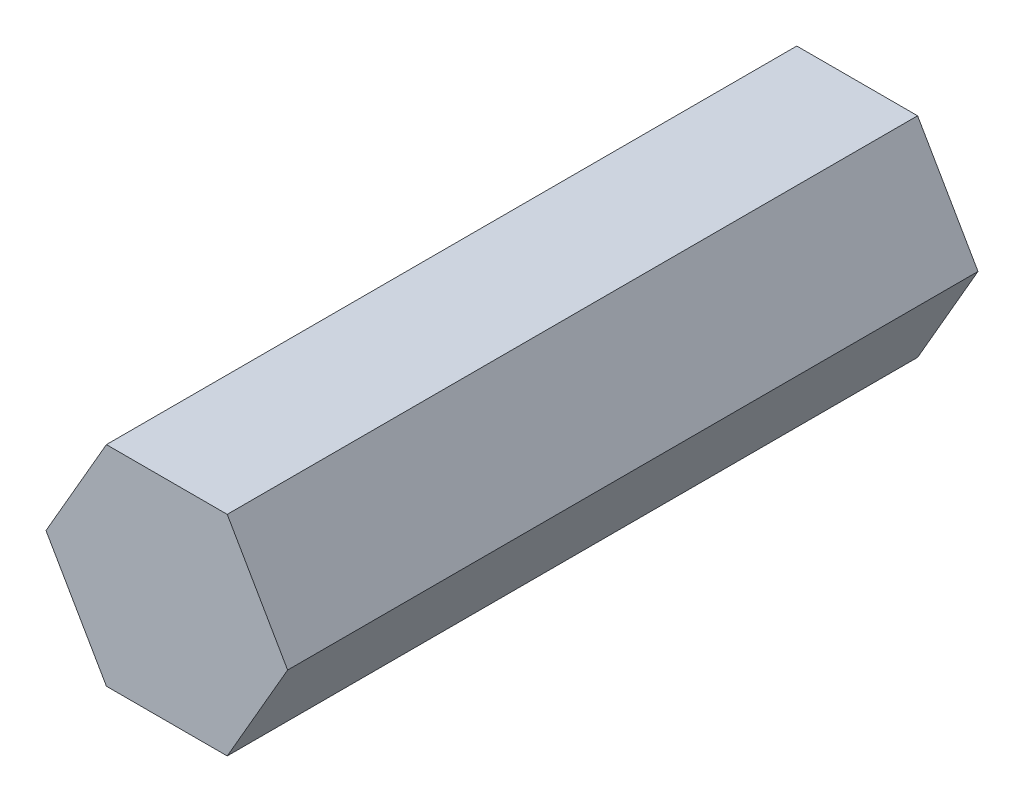
ISO-10303-21;
HEADER;
FILE_DESCRIPTION(('STEP AP214'),'2;1');
FILE_NAME('part.step','',(''),(''),'','','');
FILE_SCHEMA(('AUTOMOTIVE_DESIGN { 1 0 10303 214 1 1 1 1 }'));
ENDSEC;
DATA;
#1=APPLICATION_CONTEXT('core data for automotive mechanical design processes');
#2=APPLICATION_PROTOCOL_DEFINITION('international standard','automotive_design',2000,#1);
#3=PRODUCT_CONTEXT('',#1,'mechanical');
#4=PRODUCT('Part','Part','',(#3));
#5=PRODUCT_RELATED_PRODUCT_CATEGORY('part','',(#4));
#6=PRODUCT_DEFINITION_FORMATION('','',#4);
#7=PRODUCT_DEFINITION_CONTEXT('part definition',#1,'design');
#8=PRODUCT_DEFINITION('design','',#6,#7);
#9=PRODUCT_DEFINITION_SHAPE('','',#8);
#10=(LENGTH_UNIT() NAMED_UNIT(*) SI_UNIT(.MILLI.,.METRE.));
#11=(NAMED_UNIT(*) PLANE_ANGLE_UNIT() SI_UNIT($,.RADIAN.));
#12=(NAMED_UNIT(*) SI_UNIT($,.STERADIAN.) SOLID_ANGLE_UNIT());
#13=UNCERTAINTY_MEASURE_WITH_UNIT(LENGTH_MEASURE(1.E-05),#10,'distance_accuracy_value','');
#14=(GEOMETRIC_REPRESENTATION_CONTEXT(3) GLOBAL_UNCERTAINTY_ASSIGNED_CONTEXT((#13)) GLOBAL_UNIT_ASSIGNED_CONTEXT((#10,
#11,#12)) REPRESENTATION_CONTEXT('',''));
#15=CARTESIAN_POINT('',(0.,0.,0.));
#16=DIRECTION('',(0.,0.,1.));
#17=DIRECTION('',(1.,0.,0.));
#18=AXIS2_PLACEMENT_3D('',#15,#16,#17);
#19=CARTESIAN_POINT('',(17.5,-30.3108891324554,200.));
#20=DIRECTION('',(-0.866025403784439,0.5,0.));
#21=DIRECTION('',(-0.5,-0.866025403784439,0.));
#22=AXIS2_PLACEMENT_3D('',#19,#20,#21);
#23=PLANE('',#22);
#24=DIRECTION('',(0.5,0.866025403784439,0.));
#25=VECTOR('',#24,1.);
#26=CARTESIAN_POINT('',(17.5,-30.3108891324554,0.));
#27=LINE('',#26,#25);
#28=CARTESIAN_POINT('',(17.5,-30.3108891324554,0.));
#29=VERTEX_POINT('',#28);
#30=CARTESIAN_POINT('',(35.,0.,0.));
#31=VERTEX_POINT('',#30);
#32=EDGE_CURVE('E116',#29,#31,#27,.T.);
#33=ORIENTED_EDGE('',*,*,#32,.T.);
#34=DIRECTION('',(0.,0.,-1.));
#35=VECTOR('',#34,1.);
#36=CARTESIAN_POINT('',(35.,0.,200.));
#37=LINE('',#36,#35);
#38=CARTESIAN_POINT('',(35.,0.,200.));
#39=VERTEX_POINT('',#38);
#40=EDGE_CURVE('E11',#39,#31,#37,.T.);
#41=ORIENTED_EDGE('',*,*,#40,.F.);
#42=DIRECTION('',(0.5,0.866025403784439,0.));
#43=VECTOR('',#42,1.);
#44=CARTESIAN_POINT('',(17.5,-30.3108891324554,200.));
#45=LINE('',#44,#43);
#46=CARTESIAN_POINT('',(17.5,-30.3108891324554,200.));
#47=VERTEX_POINT('',#46);
#48=EDGE_CURVE('E126',#47,#39,#45,.T.);
#49=ORIENTED_EDGE('',*,*,#48,.F.);
#50=DIRECTION('',(0.,0.,-1.));
#51=VECTOR('',#50,1.);
#52=CARTESIAN_POINT('',(17.5,-30.3108891324554,200.));
#53=LINE('',#52,#51);
#54=EDGE_CURVE('E112',#47,#29,#53,.T.);
#55=ORIENTED_EDGE('',*,*,#54,.T.);
#56=EDGE_LOOP('',(#33,#41,#49,#55));
#57=FACE_BOUND('',#56,.T.);
#58=ADVANCED_FACE('F32',(#57),#23,.F.);
#59=CARTESIAN_POINT('',(35.,0.,200.));
#60=DIRECTION('',(-0.866025403784438,-0.5,0.));
#61=DIRECTION('',(0.5,-0.866025403784439,0.));
#62=AXIS2_PLACEMENT_3D('',#59,#60,#61);
#63=PLANE('',#62);
#64=DIRECTION('',(-0.5,0.866025403784438,0.));
#65=VECTOR('',#64,1.);
#66=CARTESIAN_POINT('',(35.,0.,0.));
#67=LINE('',#66,#65);
#68=CARTESIAN_POINT('',(17.5,30.3108891324553,0.));
#69=VERTEX_POINT('',#68);
#70=EDGE_CURVE('E119',#31,#69,#67,.T.);
#71=ORIENTED_EDGE('',*,*,#70,.T.);
#72=DIRECTION('',(0.,0.,-1.));
#73=VECTOR('',#72,1.);
#74=CARTESIAN_POINT('',(17.5,30.3108891324553,200.));
#75=LINE('',#74,#73);
#76=CARTESIAN_POINT('',(17.5,30.3108891324553,200.));
#77=VERTEX_POINT('',#76);
#78=EDGE_CURVE('E40',#77,#69,#75,.T.);
#79=ORIENTED_EDGE('',*,*,#78,.F.);
#80=DIRECTION('',(-0.5,0.866025403784438,0.));
#81=VECTOR('',#80,1.);
#82=CARTESIAN_POINT('',(35.,0.,200.));
#83=LINE('',#82,#81);
#84=EDGE_CURVE('E85',#39,#77,#83,.T.);
#85=ORIENTED_EDGE('',*,*,#84,.F.);
#86=ORIENTED_EDGE('',*,*,#40,.T.);
#87=EDGE_LOOP('',(#71,#79,#85,#86));
#88=FACE_BOUND('',#87,.T.);
#89=ADVANCED_FACE('F150',(#88),#63,.F.);
#90=CARTESIAN_POINT('',(17.5,30.3108891324553,200.));
#91=DIRECTION('',(0.,-1.,0.));
#92=DIRECTION('',(1.,0.,0.));
#93=AXIS2_PLACEMENT_3D('',#90,#91,#92);
#94=PLANE('',#93);
#95=DIRECTION('',(-1.,0.,0.));
#96=VECTOR('',#95,1.);
#97=CARTESIAN_POINT('',(17.5,30.3108891324553,0.));
#98=LINE('',#97,#96);
#99=CARTESIAN_POINT('',(-17.5,30.3108891324553,0.));
#100=VERTEX_POINT('',#99);
#101=EDGE_CURVE('E121',#69,#100,#98,.T.);
#102=ORIENTED_EDGE('',*,*,#101,.T.);
#103=DIRECTION('',(0.,0.,-1.));
#104=VECTOR('',#103,1.);
#105=CARTESIAN_POINT('',(-17.5,30.3108891324553,200.));
#106=LINE('',#105,#104);
#107=CARTESIAN_POINT('',(-17.5,30.3108891324553,200.));
#108=VERTEX_POINT('',#107);
#109=EDGE_CURVE('E107',#108,#100,#106,.T.);
#110=ORIENTED_EDGE('',*,*,#109,.F.);
#111=DIRECTION('',(-1.,0.,0.));
#112=VECTOR('',#111,1.);
#113=CARTESIAN_POINT('',(17.5,30.3108891324553,200.));
#114=LINE('',#113,#112);
#115=EDGE_CURVE('E98',#77,#108,#114,.T.);
#116=ORIENTED_EDGE('',*,*,#115,.F.);
#117=ORIENTED_EDGE('',*,*,#78,.T.);
#118=EDGE_LOOP('',(#102,#110,#116,#117));
#119=FACE_BOUND('',#118,.T.);
#120=ADVANCED_FACE('F132',(#119),#94,.F.);
#121=CARTESIAN_POINT('',(-17.5,30.3108891324553,200.));
#122=DIRECTION('',(0.866025403784439,-0.5,0.));
#123=DIRECTION('',(0.5,0.866025403784439,0.));
#124=AXIS2_PLACEMENT_3D('',#121,#122,#123);
#125=PLANE('',#124);
#126=DIRECTION('',(-0.5,-0.866025403784439,0.));
#127=VECTOR('',#126,1.);
#128=CARTESIAN_POINT('',(-17.5,30.3108891324553,0.));
#129=LINE('',#128,#127);
#130=CARTESIAN_POINT('',(-35.,0.,0.));
#131=VERTEX_POINT('',#130);
#132=EDGE_CURVE('E106',#100,#131,#129,.T.);
#133=ORIENTED_EDGE('',*,*,#132,.T.);
#134=DIRECTION('',(0.,0.,-1.));
#135=VECTOR('',#134,1.);
#136=CARTESIAN_POINT('',(-35.,0.,200.));
#137=LINE('',#136,#135);
#138=CARTESIAN_POINT('',(-35.,0.,200.));
#139=VERTEX_POINT('',#138);
#140=EDGE_CURVE('E103',#139,#131,#137,.T.);
#141=ORIENTED_EDGE('',*,*,#140,.F.);
#142=DIRECTION('',(-0.5,-0.866025403784439,0.));
#143=VECTOR('',#142,1.);
#144=CARTESIAN_POINT('',(-17.5,30.3108891324553,200.));
#145=LINE('',#144,#143);
#146=EDGE_CURVE('E92',#108,#139,#145,.T.);
#147=ORIENTED_EDGE('',*,*,#146,.F.);
#148=ORIENTED_EDGE('',*,*,#109,.T.);
#149=EDGE_LOOP('',(#133,#141,#147,#148));
#150=FACE_BOUND('',#149,.T.);
#151=ADVANCED_FACE('F104',(#150),#125,.F.);
#152=CARTESIAN_POINT('',(-35.,0.,200.));
#153=DIRECTION('',(0.866025403784439,0.5,0.));
#154=DIRECTION('',(-0.5,0.866025403784439,0.));
#155=AXIS2_PLACEMENT_3D('',#152,#153,#154);
#156=PLANE('',#155);
#157=DIRECTION('',(0.5,-0.866025403784439,0.));
#158=VECTOR('',#157,1.);
#159=CARTESIAN_POINT('',(-35.,0.,0.));
#160=LINE('',#159,#158);
#161=CARTESIAN_POINT('',(-17.5,-30.3108891324554,0.));
#162=VERTEX_POINT('',#161);
#163=EDGE_CURVE('E71',#131,#162,#160,.T.);
#164=ORIENTED_EDGE('',*,*,#163,.T.);
#165=DIRECTION('',(0.,0.,-1.));
#166=VECTOR('',#165,1.);
#167=CARTESIAN_POINT('',(-17.5,-30.3108891324554,200.));
#168=LINE('',#167,#166);
#169=CARTESIAN_POINT('',(-17.5,-30.3108891324554,200.));
#170=VERTEX_POINT('',#169);
#171=EDGE_CURVE('E108',#170,#162,#168,.T.);
#172=ORIENTED_EDGE('',*,*,#171,.F.);
#173=DIRECTION('',(0.5,-0.866025403784439,0.));
#174=VECTOR('',#173,1.);
#175=CARTESIAN_POINT('',(-35.,0.,200.));
#176=LINE('',#175,#174);
#177=EDGE_CURVE('E96',#139,#170,#176,.T.);
#178=ORIENTED_EDGE('',*,*,#177,.F.);
#179=ORIENTED_EDGE('',*,*,#140,.T.);
#180=EDGE_LOOP('',(#164,#172,#178,#179));
#181=FACE_BOUND('',#180,.T.);
#182=ADVANCED_FACE('F110',(#181),#156,.F.);
#183=CARTESIAN_POINT('',(-17.5,-30.3108891324554,200.));
#184=DIRECTION('',(0.,1.,0.));
#185=DIRECTION('',(-1.,0.,0.));
#186=AXIS2_PLACEMENT_3D('',#183,#184,#185);
#187=PLANE('',#186);
#188=DIRECTION('',(1.,0.,0.));
#189=VECTOR('',#188,1.);
#190=CARTESIAN_POINT('',(-17.5,-30.3108891324554,0.));
#191=LINE('',#190,#189);
#192=EDGE_CURVE('E77',#162,#29,#191,.T.);
#193=ORIENTED_EDGE('',*,*,#192,.T.);
#194=ORIENTED_EDGE('',*,*,#54,.F.);
#195=DIRECTION('',(1.,0.,0.));
#196=VECTOR('',#195,1.);
#197=CARTESIAN_POINT('',(-17.5,-30.3108891324554,200.));
#198=LINE('',#197,#196);
#199=EDGE_CURVE('E48',#170,#47,#198,.T.);
#200=ORIENTED_EDGE('',*,*,#199,.F.);
#201=ORIENTED_EDGE('',*,*,#171,.T.);
#202=EDGE_LOOP('',(#193,#194,#200,#201));
#203=FACE_BOUND('',#202,.T.);
#204=ADVANCED_FACE('F139',(#203),#187,.F.);
#205=CARTESIAN_POINT('',(0.,0.,200.));
#206=DIRECTION('',(0.,0.,1.));
#207=DIRECTION('',(1.,0.,0.));
#208=AXIS2_PLACEMENT_3D('',#205,#206,#207);
#209=PLANE('',#208);
#210=ORIENTED_EDGE('',*,*,#48,.T.);
#211=ORIENTED_EDGE('',*,*,#84,.T.);
#212=ORIENTED_EDGE('',*,*,#115,.T.);
#213=ORIENTED_EDGE('',*,*,#146,.T.);
#214=ORIENTED_EDGE('',*,*,#177,.T.);
#215=ORIENTED_EDGE('',*,*,#199,.T.);
#216=EDGE_LOOP('',(#210,#211,#212,#213,#214,#215));
#217=FACE_BOUND('',#216,.T.);
#218=ADVANCED_FACE('F94',(#217),#209,.T.);
#219=CARTESIAN_POINT('',(0.,0.,0.));
#220=DIRECTION('',(0.,0.,1.));
#221=DIRECTION('',(1.,0.,0.));
#222=AXIS2_PLACEMENT_3D('',#219,#220,#221);
#223=PLANE('',#222);
#224=ORIENTED_EDGE('',*,*,#32,.F.);
#225=ORIENTED_EDGE('',*,*,#192,.F.);
#226=ORIENTED_EDGE('',*,*,#163,.F.);
#227=ORIENTED_EDGE('',*,*,#132,.F.);
#228=ORIENTED_EDGE('',*,*,#101,.F.);
#229=ORIENTED_EDGE('',*,*,#70,.F.);
#230=EDGE_LOOP('',(#224,#225,#226,#227,#228,#229));
#231=FACE_BOUND('',#230,.T.);
#232=ADVANCED_FACE('F135',(#231),#223,.F.);
#233=CLOSED_SHELL('',(#58,#89,#120,#151,#182,#204,#218,#232));
#234=MANIFOLD_SOLID_BREP('B2',#233);
#235=ADVANCED_BREP_SHAPE_REPRESENTATION('',(#18,#234),#14);
#236=SHAPE_DEFINITION_REPRESENTATION(#9,#235);
ENDSEC;
END-ISO-10303-21;
